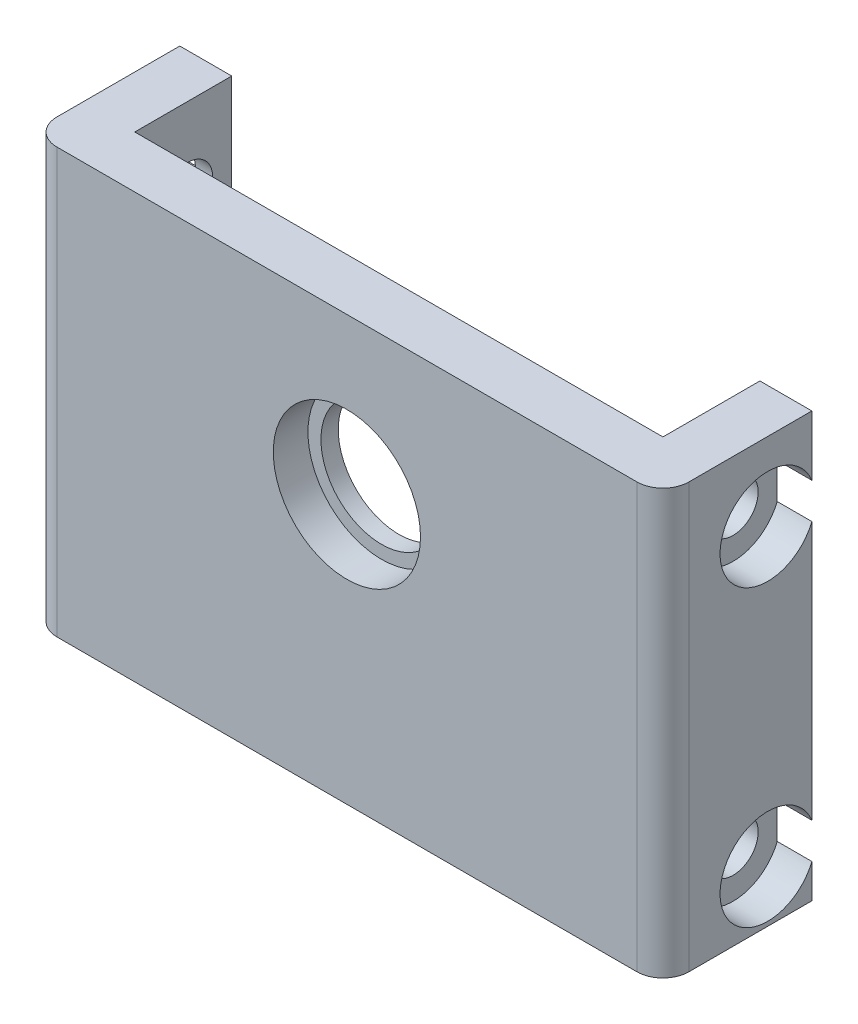
ISO-10303-21;
HEADER;
FILE_DESCRIPTION(('STEP AP214'),'2;1');
FILE_NAME('part.step','',(''),(''),'','','');
FILE_SCHEMA(('AUTOMOTIVE_DESIGN { 1 0 10303 214 1 1 1 1 }'));
ENDSEC;
DATA;
#1=APPLICATION_CONTEXT('core data for automotive mechanical design processes');
#2=APPLICATION_PROTOCOL_DEFINITION('international standard','automotive_design',2000,#1);
#3=PRODUCT_CONTEXT('',#1,'mechanical');
#4=PRODUCT('Part','Part','',(#3));
#5=PRODUCT_RELATED_PRODUCT_CATEGORY('part','',(#4));
#6=PRODUCT_DEFINITION_FORMATION('','',#4);
#7=PRODUCT_DEFINITION_CONTEXT('part definition',#1,'design');
#8=PRODUCT_DEFINITION('design','',#6,#7);
#9=PRODUCT_DEFINITION_SHAPE('','',#8);
#10=(LENGTH_UNIT() NAMED_UNIT(*) SI_UNIT(.MILLI.,.METRE.));
#11=(NAMED_UNIT(*) PLANE_ANGLE_UNIT() SI_UNIT($,.RADIAN.));
#12=(NAMED_UNIT(*) SI_UNIT($,.STERADIAN.) SOLID_ANGLE_UNIT());
#13=UNCERTAINTY_MEASURE_WITH_UNIT(LENGTH_MEASURE(1.E-05),#10,'distance_accuracy_value','');
#14=(GEOMETRIC_REPRESENTATION_CONTEXT(3) GLOBAL_UNCERTAINTY_ASSIGNED_CONTEXT((#13)) GLOBAL_UNIT_ASSIGNED_CONTEXT((#10,
#11,#12)) REPRESENTATION_CONTEXT('',''));
#15=CARTESIAN_POINT('',(0.,0.,0.));
#16=DIRECTION('',(0.,0.,1.));
#17=DIRECTION('',(1.,0.,0.));
#18=AXIS2_PLACEMENT_3D('',#15,#16,#17);
#19=CARTESIAN_POINT('',(33.25,0.,0.));
#20=DIRECTION('',(-1.,0.,0.));
#21=DIRECTION('',(0.,1.,0.));
#22=AXIS2_PLACEMENT_3D('',#19,#20,#21);
#23=PLANE('',#22);
#24=DIRECTION('',(0.,0.,-1.));
#25=VECTOR('',#24,1.);
#26=CARTESIAN_POINT('',(33.25,3.00000000000002,3.25));
#27=LINE('',#26,#25);
#28=CARTESIAN_POINT('',(33.25,3.00000000000002,1.75));
#29=VERTEX_POINT('',#28);
#30=CARTESIAN_POINT('',(33.25,3.00000000000002,-5.34999999999999));
#31=VERTEX_POINT('',#30);
#32=EDGE_CURVE('E241',#29,#31,#27,.T.);
#33=ORIENTED_EDGE('',*,*,#32,.F.);
#34=DIRECTION('',(0.,1.,0.));
#35=VECTOR('',#34,1.);
#36=CARTESIAN_POINT('',(33.25,-21.4999999999988,1.75));
#37=LINE('',#36,#35);
#38=CARTESIAN_POINT('',(33.25,-21.4999999999988,1.75));
#39=VERTEX_POINT('',#38);
#40=EDGE_CURVE('E67',#29,#39,#37,.F.);
#41=ORIENTED_EDGE('',*,*,#40,.T.);
#42=DIRECTION('',(0.,0.,1.));
#43=VECTOR('',#42,1.);
#44=CARTESIAN_POINT('',(33.25,-21.4999999999988,3.25));
#45=LINE('',#44,#43);
#46=CARTESIAN_POINT('',(33.25,-21.4999999999988,-5.34999999999999));
#47=VERTEX_POINT('',#46);
#48=EDGE_CURVE('E225',#47,#39,#45,.T.);
#49=ORIENTED_EDGE('',*,*,#48,.F.);
#50=DIRECTION('',(0.,-1.,0.));
#51=VECTOR('',#50,1.);
#52=CARTESIAN_POINT('',(33.25,3.00000000000002,-5.34999999999999));
#53=LINE('',#52,#51);
#54=CARTESIAN_POINT('',(33.25,-19.5295630140987,-5.34999999999999));
#55=VERTEX_POINT('',#54);
#56=EDGE_CURVE('E251',#55,#47,#53,.T.);
#57=ORIENTED_EDGE('',*,*,#56,.F.);
#58=CARTESIAN_POINT('',(33.25,-18.5,-2.79999999999999));
#59=DIRECTION('',(1.,0.,0.));
#60=DIRECTION('',(0.,0.,-1.));
#61=AXIS2_PLACEMENT_3D('',#58,#59,#60);
#62=CIRCLE('',#61,2.75);
#63=CARTESIAN_POINT('',(33.25,-17.4704369859013,-5.34999999999999));
#64=VERTEX_POINT('',#63);
#65=EDGE_CURVE('E362',#64,#55,#62,.T.);
#66=ORIENTED_EDGE('',*,*,#65,.F.);
#67=CARTESIAN_POINT('',(33.25,-2.52956301409871,-5.34999999999999));
#68=VERTEX_POINT('',#67);
#69=EDGE_CURVE('E249',#68,#64,#53,.T.);
#70=ORIENTED_EDGE('',*,*,#69,.F.);
#71=CARTESIAN_POINT('',(33.25,-1.50000000000002,-2.79999999999999));
#72=DIRECTION('',(1.,0.,0.));
#73=DIRECTION('',(0.,0.,-1.));
#74=AXIS2_PLACEMENT_3D('',#71,#72,#73);
#75=CIRCLE('',#74,2.75);
#76=CARTESIAN_POINT('',(33.25,-0.470436985901328,-5.34999999999999));
#77=VERTEX_POINT('',#76);
#78=EDGE_CURVE('E191',#77,#68,#75,.T.);
#79=ORIENTED_EDGE('',*,*,#78,.F.);
#80=EDGE_CURVE('E197',#31,#77,#53,.T.);
#81=ORIENTED_EDGE('',*,*,#80,.F.);
#82=EDGE_LOOP('',(#33,#41,#49,#57,#66,#70,#79,#81));
#83=FACE_BOUND('',#82,.T.);
#84=ADVANCED_FACE('F43',(#83),#23,.F.);
#85=CARTESIAN_POINT('',(-3.25,0.,0.));
#86=DIRECTION('',(1.,0.,0.));
#87=DIRECTION('',(0.,1.,0.));
#88=AXIS2_PLACEMENT_3D('',#85,#86,#87);
#89=PLANE('',#88);
#90=DIRECTION('',(0.,0.,1.));
#91=VECTOR('',#90,1.);
#92=CARTESIAN_POINT('',(-3.25,-21.4999999999988,3.25));
#93=LINE('',#92,#91);
#94=CARTESIAN_POINT('',(-3.25,-21.4999999999988,-5.34999999999999));
#95=VERTEX_POINT('',#94);
#96=CARTESIAN_POINT('',(-3.25,-21.4999999999988,1.75));
#97=VERTEX_POINT('',#96);
#98=EDGE_CURVE('E278',#95,#97,#93,.T.);
#99=ORIENTED_EDGE('',*,*,#98,.T.);
#100=DIRECTION('',(0.,1.,0.));
#101=VECTOR('',#100,1.);
#102=CARTESIAN_POINT('',(-3.25,3.00000000000002,1.75));
#103=LINE('',#102,#101);
#104=CARTESIAN_POINT('',(-3.25,3.00000000000002,1.75));
#105=VERTEX_POINT('',#104);
#106=EDGE_CURVE('E12',#97,#105,#103,.T.);
#107=ORIENTED_EDGE('',*,*,#106,.T.);
#108=DIRECTION('',(0.,0.,-1.));
#109=VECTOR('',#108,1.);
#110=CARTESIAN_POINT('',(-3.25,3.00000000000002,3.25));
#111=LINE('',#110,#109);
#112=CARTESIAN_POINT('',(-3.25,3.00000000000002,-5.34999999999999));
#113=VERTEX_POINT('',#112);
#114=EDGE_CURVE('E269',#105,#113,#111,.T.);
#115=ORIENTED_EDGE('',*,*,#114,.T.);
#116=DIRECTION('',(0.,-1.,0.));
#117=VECTOR('',#116,1.);
#118=CARTESIAN_POINT('',(-3.25,3.00000000000002,-5.34999999999999));
#119=LINE('',#118,#117);
#120=CARTESIAN_POINT('',(-3.25,-0.470436985901327,-5.34999999999999));
#121=VERTEX_POINT('',#120);
#122=EDGE_CURVE('E274',#113,#121,#119,.T.);
#123=ORIENTED_EDGE('',*,*,#122,.T.);
#124=CARTESIAN_POINT('',(-3.25,-1.50000000000001,-2.79999999999999));
#125=DIRECTION('',(-1.,0.,0.));
#126=DIRECTION('',(0.,0.,1.));
#127=AXIS2_PLACEMENT_3D('',#124,#125,#126);
#128=CIRCLE('',#127,2.75);
#129=CARTESIAN_POINT('',(-3.25,-2.52956301409871,-5.34999999999999));
#130=VERTEX_POINT('',#129);
#131=EDGE_CURVE('E366',#130,#121,#128,.T.);
#132=ORIENTED_EDGE('',*,*,#131,.F.);
#133=CARTESIAN_POINT('',(-3.25,-17.4704369859013,-5.34999999999999));
#134=VERTEX_POINT('',#133);
#135=EDGE_CURVE('E279',#130,#134,#119,.T.);
#136=ORIENTED_EDGE('',*,*,#135,.T.);
#137=CARTESIAN_POINT('',(-3.25,-18.5,-2.79999999999999));
#138=DIRECTION('',(-1.,0.,0.));
#139=DIRECTION('',(0.,0.,1.));
#140=AXIS2_PLACEMENT_3D('',#137,#138,#139);
#141=CIRCLE('',#140,2.75);
#142=CARTESIAN_POINT('',(-3.25,-19.5295630140987,-5.34999999999999));
#143=VERTEX_POINT('',#142);
#144=EDGE_CURVE('E301',#143,#134,#141,.T.);
#145=ORIENTED_EDGE('',*,*,#144,.F.);
#146=EDGE_CURVE('E272',#143,#95,#119,.T.);
#147=ORIENTED_EDGE('',*,*,#146,.T.);
#148=EDGE_LOOP('',(#99,#107,#115,#123,#132,#136,#145,#147));
#149=FACE_BOUND('',#148,.T.);
#150=ADVANCED_FACE('F435',(#149),#89,.F.);
#151=CARTESIAN_POINT('',(-0.249999999999998,-21.4999999999988,3.25));
#152=DIRECTION('',(0.,1.,0.));
#153=DIRECTION('',(0.,0.,1.));
#154=AXIS2_PLACEMENT_3D('',#151,#152,#153);
#155=PLANE('',#154);
#156=ORIENTED_EDGE('',*,*,#48,.T.);
#157=CARTESIAN_POINT('',(31.75,-21.4999999999988,1.75));
#158=DIRECTION('',(0.,1.,0.));
#159=DIRECTION('',(0.,0.,1.));
#160=AXIS2_PLACEMENT_3D('',#157,#158,#159);
#161=CIRCLE('',#160,1.5);
#162=CARTESIAN_POINT('',(31.75,-21.4999999999988,3.25));
#163=VERTEX_POINT('',#162);
#164=EDGE_CURVE('E52',#39,#163,#161,.F.);
#165=ORIENTED_EDGE('',*,*,#164,.T.);
#166=DIRECTION('',(1.,0.,0.));
#167=VECTOR('',#166,1.);
#168=CARTESIAN_POINT('',(-0.249999999999998,-21.4999999999988,3.25));
#169=LINE('',#168,#167);
#170=CARTESIAN_POINT('',(-1.75,-21.4999999999988,3.25));
#171=VERTEX_POINT('',#170);
#172=EDGE_CURVE('E223',#171,#163,#169,.T.);
#173=ORIENTED_EDGE('',*,*,#172,.F.);
#174=CARTESIAN_POINT('',(-1.75,-21.4999999999988,1.75));
#175=DIRECTION('',(0.,1.,0.));
#176=DIRECTION('',(0.,0.,1.));
#177=AXIS2_PLACEMENT_3D('',#174,#175,#176);
#178=CIRCLE('',#177,1.5);
#179=EDGE_CURVE('E59',#171,#97,#178,.F.);
#180=ORIENTED_EDGE('',*,*,#179,.T.);
#181=ORIENTED_EDGE('',*,*,#98,.F.);
#182=DIRECTION('',(1.,0.,0.));
#183=VECTOR('',#182,1.);
#184=CARTESIAN_POINT('',(-3.25,-21.4999999999988,-5.34999999999999));
#185=LINE('',#184,#183);
#186=CARTESIAN_POINT('',(-0.249999999999998,-21.4999999999988,-5.34999999999999));
#187=VERTEX_POINT('',#186);
#188=EDGE_CURVE('E282',#95,#187,#185,.T.);
#189=ORIENTED_EDGE('',*,*,#188,.T.);
#190=DIRECTION('',(0.,0.,1.));
#191=VECTOR('',#190,1.);
#192=CARTESIAN_POINT('',(-0.249999999999998,-21.4999999999988,3.25));
#193=LINE('',#192,#191);
#194=CARTESIAN_POINT('',(-0.249999999999998,-21.4999999999988,0.25));
#195=VERTEX_POINT('',#194);
#196=EDGE_CURVE('E273',#187,#195,#193,.T.);
#197=ORIENTED_EDGE('',*,*,#196,.T.);
#198=DIRECTION('',(1.,0.,0.));
#199=VECTOR('',#198,1.);
#200=CARTESIAN_POINT('',(-0.249999999999998,-21.4999999999988,0.25));
#201=LINE('',#200,#199);
#202=CARTESIAN_POINT('',(30.25,-21.4999999999988,0.25));
#203=VERTEX_POINT('',#202);
#204=EDGE_CURVE('E305',#195,#203,#201,.T.);
#205=ORIENTED_EDGE('',*,*,#204,.T.);
#206=DIRECTION('',(0.,0.,1.));
#207=VECTOR('',#206,1.);
#208=CARTESIAN_POINT('',(30.25,-21.4999999999988,3.25));
#209=LINE('',#208,#207);
#210=CARTESIAN_POINT('',(30.25,-21.4999999999988,-5.34999999999999));
#211=VERTEX_POINT('',#210);
#212=EDGE_CURVE('E254',#211,#203,#209,.T.);
#213=ORIENTED_EDGE('',*,*,#212,.F.);
#214=DIRECTION('',(-1.,0.,0.));
#215=VECTOR('',#214,1.);
#216=CARTESIAN_POINT('',(33.25,-21.4999999999988,-5.34999999999999));
#217=LINE('',#216,#215);
#218=EDGE_CURVE('E247',#47,#211,#217,.T.);
#219=ORIENTED_EDGE('',*,*,#218,.F.);
#220=EDGE_LOOP('',(#156,#165,#173,#180,#181,#189,#197,#205,#213,#219));
#221=FACE_BOUND('',#220,.T.);
#222=ADVANCED_FACE('F222',(#221),#155,.F.);
#223=CARTESIAN_POINT('',(-0.250000000000001,3.00000000000002,3.25));
#224=DIRECTION('',(0.,-1.,0.));
#225=DIRECTION('',(0.,0.,-1.));
#226=AXIS2_PLACEMENT_3D('',#223,#224,#225);
#227=PLANE('',#226);
#228=DIRECTION('',(-1.,0.,0.));
#229=VECTOR('',#228,1.);
#230=CARTESIAN_POINT('',(-0.250000000000001,3.00000000000002,3.25));
#231=LINE('',#230,#229);
#232=CARTESIAN_POINT('',(31.75,3.00000000000002,3.25));
#233=VERTEX_POINT('',#232);
#234=CARTESIAN_POINT('',(-1.75,3.00000000000002,3.25));
#235=VERTEX_POINT('',#234);
#236=EDGE_CURVE('E234',#233,#235,#231,.T.);
#237=ORIENTED_EDGE('',*,*,#236,.F.);
#238=CARTESIAN_POINT('',(31.75,3.00000000000002,1.75));
#239=DIRECTION('',(0.,-1.,0.));
#240=DIRECTION('',(0.,0.,-1.));
#241=AXIS2_PLACEMENT_3D('',#238,#239,#240);
#242=CIRCLE('',#241,1.5);
#243=EDGE_CURVE('E213',#233,#29,#242,.F.);
#244=ORIENTED_EDGE('',*,*,#243,.T.);
#245=ORIENTED_EDGE('',*,*,#32,.T.);
#246=DIRECTION('',(-1.,0.,0.));
#247=VECTOR('',#246,1.);
#248=CARTESIAN_POINT('',(33.25,3.00000000000002,-5.34999999999999));
#249=LINE('',#248,#247);
#250=CARTESIAN_POINT('',(30.25,3.00000000000002,-5.34999999999999));
#251=VERTEX_POINT('',#250);
#252=EDGE_CURVE('E243',#31,#251,#249,.T.);
#253=ORIENTED_EDGE('',*,*,#252,.T.);
#254=DIRECTION('',(0.,0.,-1.));
#255=VECTOR('',#254,1.);
#256=CARTESIAN_POINT('',(30.25,3.00000000000002,3.25));
#257=LINE('',#256,#255);
#258=CARTESIAN_POINT('',(30.25,3.00000000000002,0.25));
#259=VERTEX_POINT('',#258);
#260=EDGE_CURVE('E263',#259,#251,#257,.T.);
#261=ORIENTED_EDGE('',*,*,#260,.F.);
#262=DIRECTION('',(-1.,0.,0.));
#263=VECTOR('',#262,1.);
#264=CARTESIAN_POINT('',(-0.250000000000001,3.00000000000002,0.25));
#265=LINE('',#264,#263);
#266=CARTESIAN_POINT('',(-0.250000000000001,3.00000000000002,0.25));
#267=VERTEX_POINT('',#266);
#268=EDGE_CURVE('E235',#259,#267,#265,.T.);
#269=ORIENTED_EDGE('',*,*,#268,.T.);
#270=DIRECTION('',(0.,0.,-1.));
#271=VECTOR('',#270,1.);
#272=CARTESIAN_POINT('',(-0.250000000000001,3.00000000000002,3.25));
#273=LINE('',#272,#271);
#274=CARTESIAN_POINT('',(-0.250000000000001,3.00000000000002,-5.34999999999999));
#275=VERTEX_POINT('',#274);
#276=EDGE_CURVE('E268',#267,#275,#273,.T.);
#277=ORIENTED_EDGE('',*,*,#276,.T.);
#278=DIRECTION('',(1.,0.,0.));
#279=VECTOR('',#278,1.);
#280=CARTESIAN_POINT('',(-3.25,3.00000000000002,-5.34999999999999));
#281=LINE('',#280,#279);
#282=EDGE_CURVE('E294',#113,#275,#281,.T.);
#283=ORIENTED_EDGE('',*,*,#282,.F.);
#284=ORIENTED_EDGE('',*,*,#114,.F.);
#285=CARTESIAN_POINT('',(-1.75,3.00000000000002,1.75));
#286=DIRECTION('',(0.,-1.,0.));
#287=DIRECTION('',(0.,0.,-1.));
#288=AXIS2_PLACEMENT_3D('',#285,#286,#287);
#289=CIRCLE('',#288,1.5);
#290=EDGE_CURVE('E210',#105,#235,#289,.F.);
#291=ORIENTED_EDGE('',*,*,#290,.T.);
#292=EDGE_LOOP('',(#237,#244,#245,#253,#261,#269,#277,#283,#284,#291));
#293=FACE_BOUND('',#292,.T.);
#294=ADVANCED_FACE('F239',(#293),#227,.F.);
#295=CARTESIAN_POINT('',(0.,0.,3.25));
#296=DIRECTION('',(0.,0.,1.));
#297=DIRECTION('',(1.,0.,0.));
#298=AXIS2_PLACEMENT_3D('',#295,#296,#297);
#299=PLANE('',#298);
#300=CARTESIAN_POINT('',(15.,-6.00000000000003,3.25));
#301=DIRECTION('',(0.,0.,1.));
#302=DIRECTION('',(1.,0.,0.));
#303=AXIS2_PLACEMENT_3D('',#300,#301,#302);
#304=CIRCLE('',#303,4.25000000000001);
#305=CARTESIAN_POINT('',(19.25,-6.00000000000003,3.25));
#306=VERTEX_POINT('',#305);
#307=EDGE_CURVE('E318',#306,#306,#304,.T.);
#308=ORIENTED_EDGE('',*,*,#307,.F.);
#309=EDGE_LOOP('',(#308));
#310=FACE_BOUND('',#309,.T.);
#311=ORIENTED_EDGE('',*,*,#172,.T.);
#312=DIRECTION('',(0.,1.,0.));
#313=VECTOR('',#312,1.);
#314=CARTESIAN_POINT('',(31.75,3.00000000000002,3.25));
#315=LINE('',#314,#313);
#316=EDGE_CURVE('E203',#163,#233,#315,.T.);
#317=ORIENTED_EDGE('',*,*,#316,.T.);
#318=ORIENTED_EDGE('',*,*,#236,.T.);
#319=DIRECTION('',(0.,1.,0.));
#320=VECTOR('',#319,1.);
#321=CARTESIAN_POINT('',(-1.75,-21.4999999999988,3.25));
#322=LINE('',#321,#320);
#323=EDGE_CURVE('E199',#235,#171,#322,.F.);
#324=ORIENTED_EDGE('',*,*,#323,.T.);
#325=EDGE_LOOP('',(#311,#317,#318,#324));
#326=FACE_BOUND('',#325,.T.);
#327=ADVANCED_FACE('F229',(#310,#326),#299,.T.);
#328=CARTESIAN_POINT('',(0.,0.,0.25));
#329=DIRECTION('',(0.,0.,1.));
#330=DIRECTION('',(1.,0.,0.));
#331=AXIS2_PLACEMENT_3D('',#328,#329,#330);
#332=PLANE('',#331);
#333=CARTESIAN_POINT('',(15.,-6.00000000000001,0.25));
#334=DIRECTION('',(0.,0.,1.));
#335=DIRECTION('',(1.,0.,0.));
#336=AXIS2_PLACEMENT_3D('',#333,#334,#335);
#337=CIRCLE('',#336,3.5);
#338=CARTESIAN_POINT('',(18.5,-6.00000000000001,0.25));
#339=VERTEX_POINT('',#338);
#340=EDGE_CURVE('E314',#339,#339,#337,.T.);
#341=ORIENTED_EDGE('',*,*,#340,.T.);
#342=EDGE_LOOP('',(#341));
#343=FACE_BOUND('',#342,.T.);
#344=DIRECTION('',(0.,-1.,0.));
#345=VECTOR('',#344,1.);
#346=CARTESIAN_POINT('',(-0.250000000000001,3.00000000000002,0.25));
#347=LINE('',#346,#345);
#348=EDGE_CURVE('E297',#267,#195,#347,.T.);
#349=ORIENTED_EDGE('',*,*,#348,.F.);
#350=ORIENTED_EDGE('',*,*,#268,.F.);
#351=DIRECTION('',(0.,1.,0.));
#352=VECTOR('',#351,1.);
#353=CARTESIAN_POINT('',(30.25,3.00000000000002,0.25));
#354=LINE('',#353,#352);
#355=EDGE_CURVE('E308',#203,#259,#354,.T.);
#356=ORIENTED_EDGE('',*,*,#355,.F.);
#357=ORIENTED_EDGE('',*,*,#204,.F.);
#358=EDGE_LOOP('',(#349,#350,#356,#357));
#359=FACE_BOUND('',#358,.T.);
#360=ADVANCED_FACE('F423',(#343,#359),#332,.F.);
#361=CARTESIAN_POINT('',(-3.25,3.00000000000002,-5.34999999999999));
#362=DIRECTION('',(0.,0.,1.));
#363=DIRECTION('',(0.,-1.,0.));
#364=AXIS2_PLACEMENT_3D('',#361,#362,#363);
#365=PLANE('',#364);
#366=DIRECTION('',(0.,1.,0.));
#367=VECTOR('',#366,1.);
#368=CARTESIAN_POINT('',(-1.25,3.00000000000002,-5.34999999999999));
#369=LINE('',#368,#367);
#370=CARTESIAN_POINT('',(-1.25,-2.52956301409871,-5.34999999999999));
#371=VERTEX_POINT('',#370);
#372=CARTESIAN_POINT('',(-1.25,-0.470436985901319,-5.34999999999999));
#373=VERTEX_POINT('',#372);
#374=EDGE_CURVE('E332',#371,#373,#369,.T.);
#375=ORIENTED_EDGE('',*,*,#374,.T.);
#376=DIRECTION('',(-1.,0.,0.));
#377=VECTOR('',#376,1.);
#378=CARTESIAN_POINT('',(-3.25,-0.470436985901323,-5.34999999999999));
#379=LINE('',#378,#377);
#380=EDGE_CURVE('E340',#373,#121,#379,.T.);
#381=ORIENTED_EDGE('',*,*,#380,.T.);
#382=ORIENTED_EDGE('',*,*,#122,.F.);
#383=ORIENTED_EDGE('',*,*,#282,.T.);
#384=DIRECTION('',(0.,-1.,0.));
#385=VECTOR('',#384,1.);
#386=CARTESIAN_POINT('',(-0.250000000000001,3.00000000000002,-5.34999999999999));
#387=LINE('',#386,#385);
#388=EDGE_CURVE('E285',#275,#187,#387,.T.);
#389=ORIENTED_EDGE('',*,*,#388,.T.);
#390=ORIENTED_EDGE('',*,*,#188,.F.);
#391=ORIENTED_EDGE('',*,*,#146,.F.);
#392=DIRECTION('',(-1.,0.,0.));
#393=VECTOR('',#392,1.);
#394=CARTESIAN_POINT('',(-3.25,-19.5295630140987,-5.34999999999999));
#395=LINE('',#394,#393);
#396=CARTESIAN_POINT('',(-1.25,-19.5295630140987,-5.34999999999999));
#397=VERTEX_POINT('',#396);
#398=EDGE_CURVE('E320',#143,#397,#395,.F.);
#399=ORIENTED_EDGE('',*,*,#398,.T.);
#400=DIRECTION('',(0.,1.,0.));
#401=VECTOR('',#400,1.);
#402=CARTESIAN_POINT('',(-1.25,3.00000000000002,-5.34999999999999));
#403=LINE('',#402,#401);
#404=CARTESIAN_POINT('',(-1.25,-17.4704369859013,-5.34999999999999));
#405=VERTEX_POINT('',#404);
#406=EDGE_CURVE('E324',#397,#405,#403,.T.);
#407=ORIENTED_EDGE('',*,*,#406,.T.);
#408=DIRECTION('',(-1.,0.,0.));
#409=VECTOR('',#408,1.);
#410=CARTESIAN_POINT('',(-3.25,-17.4704369859013,-5.34999999999999));
#411=LINE('',#410,#409);
#412=EDGE_CURVE('E328',#405,#134,#411,.T.);
#413=ORIENTED_EDGE('',*,*,#412,.T.);
#414=ORIENTED_EDGE('',*,*,#135,.F.);
#415=DIRECTION('',(-1.,0.,0.));
#416=VECTOR('',#415,1.);
#417=CARTESIAN_POINT('',(-3.25,-2.52956301409871,-5.34999999999999));
#418=LINE('',#417,#416);
#419=EDGE_CURVE('E336',#130,#371,#418,.F.);
#420=ORIENTED_EDGE('',*,*,#419,.T.);
#421=EDGE_LOOP('',(#375,#381,#382,#383,#389,#390,#391,#399,#407,#413,#414,#420));
#422=FACE_BOUND('',#421,.T.);
#423=ADVANCED_FACE('F430',(#422),#365,.F.);
#424=CARTESIAN_POINT('',(-0.25,0.,0.));
#425=DIRECTION('',(1.,0.,0.));
#426=DIRECTION('',(0.,1.,0.));
#427=AXIS2_PLACEMENT_3D('',#424,#425,#426);
#428=PLANE('',#427);
#429=CARTESIAN_POINT('',(-0.25,-1.50000000000001,-2.79999999999999));
#430=DIRECTION('',(1.,0.,0.));
#431=DIRECTION('',(0.,1.,0.));
#432=AXIS2_PLACEMENT_3D('',#429,#430,#431);
#433=CIRCLE('',#432,1.45);
#434=CARTESIAN_POINT('',(-0.25,-0.0500000000000149,-2.79999999999999));
#435=VERTEX_POINT('',#434);
#436=EDGE_CURVE('E382',#435,#435,#433,.T.);
#437=ORIENTED_EDGE('',*,*,#436,.F.);
#438=EDGE_LOOP('',(#437));
#439=FACE_BOUND('',#438,.T.);
#440=CARTESIAN_POINT('',(-0.249999999999998,-18.5,-2.79999999999999));
#441=DIRECTION('',(1.,0.,0.));
#442=DIRECTION('',(0.,1.,0.));
#443=AXIS2_PLACEMENT_3D('',#440,#441,#442);
#444=CIRCLE('',#443,1.45);
#445=CARTESIAN_POINT('',(-0.249999999999998,-17.05,-2.79999999999999));
#446=VERTEX_POINT('',#445);
#447=EDGE_CURVE('E397',#446,#446,#444,.T.);
#448=ORIENTED_EDGE('',*,*,#447,.F.);
#449=EDGE_LOOP('',(#448));
#450=FACE_BOUND('',#449,.T.);
#451=ORIENTED_EDGE('',*,*,#276,.F.);
#452=ORIENTED_EDGE('',*,*,#348,.T.);
#453=ORIENTED_EDGE('',*,*,#196,.F.);
#454=ORIENTED_EDGE('',*,*,#388,.F.);
#455=EDGE_LOOP('',(#451,#452,#453,#454));
#456=FACE_BOUND('',#455,.T.);
#457=ADVANCED_FACE('F427',(#439,#450,#456),#428,.T.);
#458=CARTESIAN_POINT('',(33.25,3.00000000000002,-5.34999999999999));
#459=DIRECTION('',(0.,0.,-1.));
#460=DIRECTION('',(0.,1.,0.));
#461=AXIS2_PLACEMENT_3D('',#458,#459,#460);
#462=PLANE('',#461);
#463=DIRECTION('',(1.,0.,0.));
#464=VECTOR('',#463,1.);
#465=CARTESIAN_POINT('',(33.25,-0.470436985901324,-5.34999999999999));
#466=LINE('',#465,#464);
#467=CARTESIAN_POINT('',(31.25,-0.470436985901319,-5.34999999999999));
#468=VERTEX_POINT('',#467);
#469=EDGE_CURVE('E187',#468,#77,#466,.T.);
#470=ORIENTED_EDGE('',*,*,#469,.F.);
#471=DIRECTION('',(0.,1.,0.));
#472=VECTOR('',#471,1.);
#473=CARTESIAN_POINT('',(31.25,3.00000000000002,-5.34999999999999));
#474=LINE('',#473,#472);
#475=CARTESIAN_POINT('',(31.25,-2.52956301409871,-5.34999999999999));
#476=VERTEX_POINT('',#475);
#477=EDGE_CURVE('E172',#476,#468,#474,.T.);
#478=ORIENTED_EDGE('',*,*,#477,.F.);
#479=DIRECTION('',(1.,0.,0.));
#480=VECTOR('',#479,1.);
#481=CARTESIAN_POINT('',(33.25,-2.52956301409871,-5.34999999999999));
#482=LINE('',#481,#480);
#483=EDGE_CURVE('E182',#68,#476,#482,.F.);
#484=ORIENTED_EDGE('',*,*,#483,.F.);
#485=ORIENTED_EDGE('',*,*,#69,.T.);
#486=DIRECTION('',(1.,0.,0.));
#487=VECTOR('',#486,1.);
#488=CARTESIAN_POINT('',(33.25,-17.4704369859013,-5.34999999999999));
#489=LINE('',#488,#487);
#490=CARTESIAN_POINT('',(31.25,-17.4704369859013,-5.34999999999999));
#491=VERTEX_POINT('',#490);
#492=EDGE_CURVE('E357',#491,#64,#489,.T.);
#493=ORIENTED_EDGE('',*,*,#492,.F.);
#494=DIRECTION('',(0.,1.,0.));
#495=VECTOR('',#494,1.);
#496=CARTESIAN_POINT('',(31.25,3.00000000000002,-5.34999999999999));
#497=LINE('',#496,#495);
#498=CARTESIAN_POINT('',(31.25,-19.5295630140987,-5.34999999999999));
#499=VERTEX_POINT('',#498);
#500=EDGE_CURVE('E183',#499,#491,#497,.T.);
#501=ORIENTED_EDGE('',*,*,#500,.F.);
#502=DIRECTION('',(1.,0.,0.));
#503=VECTOR('',#502,1.);
#504=CARTESIAN_POINT('',(33.25,-19.5295630140987,-5.34999999999999));
#505=LINE('',#504,#503);
#506=EDGE_CURVE('E359',#55,#499,#505,.F.);
#507=ORIENTED_EDGE('',*,*,#506,.F.);
#508=ORIENTED_EDGE('',*,*,#56,.T.);
#509=ORIENTED_EDGE('',*,*,#218,.T.);
#510=DIRECTION('',(0.,-1.,0.));
#511=VECTOR('',#510,1.);
#512=CARTESIAN_POINT('',(30.25,3.00000000000002,-5.34999999999999));
#513=LINE('',#512,#511);
#514=EDGE_CURVE('E258',#251,#211,#513,.T.);
#515=ORIENTED_EDGE('',*,*,#514,.F.);
#516=ORIENTED_EDGE('',*,*,#252,.F.);
#517=ORIENTED_EDGE('',*,*,#80,.T.);
#518=EDGE_LOOP('',(#470,#478,#484,#485,#493,#501,#507,#508,#509,#515,#516,#517));
#519=FACE_BOUND('',#518,.T.);
#520=ADVANCED_FACE('F194',(#519),#462,.T.);
#521=CARTESIAN_POINT('',(30.25,0.,0.));
#522=DIRECTION('',(-1.,0.,0.));
#523=DIRECTION('',(0.,1.,0.));
#524=AXIS2_PLACEMENT_3D('',#521,#522,#523);
#525=PLANE('',#524);
#526=CARTESIAN_POINT('',(30.25,-1.50000000000002,-2.79999999999999));
#527=DIRECTION('',(-1.,0.,0.));
#528=DIRECTION('',(0.,-1.,0.));
#529=AXIS2_PLACEMENT_3D('',#526,#527,#528);
#530=CIRCLE('',#529,1.45);
#531=CARTESIAN_POINT('',(30.25,-2.95000000000002,-2.79999999999999));
#532=VERTEX_POINT('',#531);
#533=EDGE_CURVE('E732',#532,#532,#530,.T.);
#534=ORIENTED_EDGE('',*,*,#533,.F.);
#535=EDGE_LOOP('',(#534));
#536=FACE_BOUND('',#535,.T.);
#537=CARTESIAN_POINT('',(30.25,-18.5,-2.79999999999999));
#538=DIRECTION('',(-1.,0.,0.));
#539=DIRECTION('',(0.,-1.,0.));
#540=AXIS2_PLACEMENT_3D('',#537,#538,#539);
#541=CIRCLE('',#540,1.45);
#542=CARTESIAN_POINT('',(30.25,-19.95,-2.79999999999999));
#543=VERTEX_POINT('',#542);
#544=EDGE_CURVE('E372',#543,#543,#541,.T.);
#545=ORIENTED_EDGE('',*,*,#544,.F.);
#546=EDGE_LOOP('',(#545));
#547=FACE_BOUND('',#546,.T.);
#548=ORIENTED_EDGE('',*,*,#212,.T.);
#549=ORIENTED_EDGE('',*,*,#355,.T.);
#550=ORIENTED_EDGE('',*,*,#260,.T.);
#551=ORIENTED_EDGE('',*,*,#514,.T.);
#552=EDGE_LOOP('',(#548,#549,#550,#551));
#553=FACE_BOUND('',#552,.T.);
#554=ADVANCED_FACE('F417',(#536,#547,#553),#525,.T.);
#555=CARTESIAN_POINT('',(15.,-6.00000000000003,-11.7708152801713));
#556=DIRECTION('',(0.,0.,1.));
#557=DIRECTION('',(1.,0.,0.));
#558=AXIS2_PLACEMENT_3D('',#555,#556,#557);
#559=CYLINDRICAL_SURFACE('',#558,4.25000000000001);
#560=CARTESIAN_POINT('',(15.,-6.00000000000003,1.25));
#561=DIRECTION('',(0.,0.,1.));
#562=DIRECTION('',(1.,0.,0.));
#563=AXIS2_PLACEMENT_3D('',#560,#561,#562);
#564=CIRCLE('',#563,4.25000000000001);
#565=CARTESIAN_POINT('',(19.25,-6.00000000000003,1.25));
#566=VERTEX_POINT('',#565);
#567=EDGE_CURVE('E259',#566,#566,#564,.F.);
#568=CARTESIAN_POINT('',(19.25,-6.00000000000003,1.25));
#569=CARTESIAN_POINT('',(19.25,-6.00000000000003,1.27083333333333));
#570=CARTESIAN_POINT('',(19.25,-6.00000000000003,1.29166666666667));
#571=CARTESIAN_POINT('',(19.25,-6.00000000000003,1.33333333333333));
#572=CARTESIAN_POINT('',(19.25,-6.00000000000003,1.35416666666667));
#573=CARTESIAN_POINT('',(19.25,-6.00000000000003,1.39583333333333));
#574=CARTESIAN_POINT('',(19.25,-6.00000000000003,1.41666666666667));
#575=CARTESIAN_POINT('',(19.25,-6.00000000000003,1.45833333333333));
#576=CARTESIAN_POINT('',(19.25,-6.00000000000003,1.47916666666667));
#577=CARTESIAN_POINT('',(19.25,-6.00000000000003,1.52083333333333));
#578=CARTESIAN_POINT('',(19.25,-6.00000000000003,1.54166666666667));
#579=CARTESIAN_POINT('',(19.25,-6.00000000000003,1.58333333333333));
#580=CARTESIAN_POINT('',(19.25,-6.00000000000003,1.60416666666667));
#581=CARTESIAN_POINT('',(19.25,-6.00000000000003,1.64583333333333));
#582=CARTESIAN_POINT('',(19.25,-6.00000000000003,1.66666666666667));
#583=CARTESIAN_POINT('',(19.25,-6.00000000000003,1.70833333333333));
#584=CARTESIAN_POINT('',(19.25,-6.00000000000003,1.72916666666667));
#585=CARTESIAN_POINT('',(19.25,-6.00000000000003,1.77083333333333));
#586=CARTESIAN_POINT('',(19.25,-6.00000000000003,1.79166666666667));
#587=CARTESIAN_POINT('',(19.25,-6.00000000000003,1.83333333333333));
#588=CARTESIAN_POINT('',(19.25,-6.00000000000003,1.85416666666667));
#589=CARTESIAN_POINT('',(19.25,-6.00000000000003,1.89583333333333));
#590=CARTESIAN_POINT('',(19.25,-6.00000000000003,1.91666666666667));
#591=CARTESIAN_POINT('',(19.25,-6.00000000000003,1.95833333333333));
#592=CARTESIAN_POINT('',(19.25,-6.00000000000003,1.97916666666667));
#593=CARTESIAN_POINT('',(19.25,-6.00000000000003,2.02083333333333));
#594=CARTESIAN_POINT('',(19.25,-6.00000000000003,2.04166666666667));
#595=CARTESIAN_POINT('',(19.25,-6.00000000000003,2.08333333333333));
#596=CARTESIAN_POINT('',(19.25,-6.00000000000003,2.10416666666667));
#597=CARTESIAN_POINT('',(19.25,-6.00000000000003,2.14583333333333));
#598=CARTESIAN_POINT('',(19.25,-6.00000000000003,2.16666666666667));
#599=CARTESIAN_POINT('',(19.25,-6.00000000000003,2.20833333333333));
#600=CARTESIAN_POINT('',(19.25,-6.00000000000003,2.22916666666667));
#601=CARTESIAN_POINT('',(19.25,-6.00000000000003,2.27083333333333));
#602=CARTESIAN_POINT('',(19.25,-6.00000000000003,2.29166666666667));
#603=CARTESIAN_POINT('',(19.25,-6.00000000000003,2.33333333333333));
#604=CARTESIAN_POINT('',(19.25,-6.00000000000003,2.35416666666667));
#605=CARTESIAN_POINT('',(19.25,-6.00000000000003,2.39583333333333));
#606=CARTESIAN_POINT('',(19.25,-6.00000000000003,2.41666666666667));
#607=CARTESIAN_POINT('',(19.25,-6.00000000000003,2.45833333333333));
#608=CARTESIAN_POINT('',(19.25,-6.00000000000003,2.47916666666667));
#609=CARTESIAN_POINT('',(19.25,-6.00000000000003,2.52083333333333));
#610=CARTESIAN_POINT('',(19.25,-6.00000000000003,2.54166666666667));
#611=CARTESIAN_POINT('',(19.25,-6.00000000000003,2.58333333333333));
#612=CARTESIAN_POINT('',(19.25,-6.00000000000003,2.60416666666667));
#613=CARTESIAN_POINT('',(19.25,-6.00000000000003,2.64583333333333));
#614=CARTESIAN_POINT('',(19.25,-6.00000000000003,2.66666666666667));
#615=CARTESIAN_POINT('',(19.25,-6.00000000000003,2.70833333333333));
#616=CARTESIAN_POINT('',(19.25,-6.00000000000003,2.72916666666667));
#617=CARTESIAN_POINT('',(19.25,-6.00000000000003,2.77083333333333));
#618=CARTESIAN_POINT('',(19.25,-6.00000000000003,2.79166666666667));
#619=CARTESIAN_POINT('',(19.25,-6.00000000000003,2.83333333333333));
#620=CARTESIAN_POINT('',(19.25,-6.00000000000003,2.85416666666667));
#621=CARTESIAN_POINT('',(19.25,-6.00000000000003,2.89583333333333));
#622=CARTESIAN_POINT('',(19.25,-6.00000000000003,2.91666666666667));
#623=CARTESIAN_POINT('',(19.25,-6.00000000000003,2.95833333333333));
#624=CARTESIAN_POINT('',(19.25,-6.00000000000003,2.97916666666667));
#625=CARTESIAN_POINT('',(19.25,-6.00000000000003,3.02083333333333));
#626=CARTESIAN_POINT('',(19.25,-6.00000000000003,3.04166666666667));
#627=CARTESIAN_POINT('',(19.25,-6.00000000000003,3.08333333333333));
#628=CARTESIAN_POINT('',(19.25,-6.00000000000003,3.10416666666667));
#629=CARTESIAN_POINT('',(19.25,-6.00000000000003,3.14583333333333));
#630=CARTESIAN_POINT('',(19.25,-6.00000000000003,3.16666666666667));
#631=CARTESIAN_POINT('',(19.25,-6.00000000000003,3.20833333333333));
#632=CARTESIAN_POINT('',(19.25,-6.00000000000003,3.22916666666667));
#633=CARTESIAN_POINT('',(19.25,-6.00000000000003,3.25));
#634=B_SPLINE_CURVE_WITH_KNOTS('',3,(#568,#569,#570,#571,#572,#573,#574,#575,#576,#577,#578,
#579,#580,#581,#582,#583,#584,#585,#586,#587,#588,#589,#590,#591,#592,#593,#594,#595,#596,#597,
#598,#599,#600,#601,#602,#603,#604,#605,#606,#607,#608,#609,#610,#611,#612,#613,#614,#615,#616,
#617,#618,#619,#620,#621,#622,#623,#624,#625,#626,#627,#628,#629,#630,#631,#632,#633),
.UNSPECIFIED.,.F.,.F.,(4,2,2,2,2,2,2,2,2,2,2,2,2,2,2,2,2,2,2,2,2,2,2,2,2,2,2,2,2,2,2,2,4),(0.,
0.0625000000000001,0.125,0.1875,0.25,0.3125,0.375,0.4375,0.5,0.5625,0.625000000000001,
0.687500000000001,0.750000000000001,0.812500000000001,0.875000000000001,0.937500000000001,1.,
1.0625,1.125,1.1875,1.25,1.3125,1.375,1.4375,1.5,1.5625,1.625,1.6875,1.75,1.8125,1.875,1.9375,
2.),.UNSPECIFIED.);
#635=EDGE_CURVE('BSEAM476',#566,#306,#634,.T.);
#636=ORIENTED_EDGE('',*,*,#567,.T.);
#637=ORIENTED_EDGE('',*,*,#307,.T.);
#638=ORIENTED_EDGE('',*,*,#635,.T.);
#639=ORIENTED_EDGE('',*,*,#635,.F.);
#640=EDGE_LOOP('',(#636,#638,#637,#639));
#641=FACE_BOUND('',#640,.T.);
#642=ADVANCED_FACE('F476',(#641),#559,.F.);
#643=CARTESIAN_POINT('',(0.,0.,1.25));
#644=DIRECTION('',(0.,0.,1.));
#645=DIRECTION('',(1.,0.,0.));
#646=AXIS2_PLACEMENT_3D('',#643,#644,#645);
#647=PLANE('',#646);
#648=CARTESIAN_POINT('',(15.,-6.00000000000001,1.25));
#649=DIRECTION('',(0.,0.,1.));
#650=DIRECTION('',(1.,0.,0.));
#651=AXIS2_PLACEMENT_3D('',#648,#649,#650);
#652=CIRCLE('',#651,3.5);
#653=CARTESIAN_POINT('',(18.5,-6.00000000000001,1.25));
#654=VERTEX_POINT('',#653);
#655=EDGE_CURVE('E319',#654,#654,#652,.T.);
#656=ORIENTED_EDGE('',*,*,#655,.F.);
#657=EDGE_LOOP('',(#656));
#658=FACE_BOUND('',#657,.T.);
#659=ORIENTED_EDGE('',*,*,#567,.F.);
#660=EDGE_LOOP('',(#659));
#661=FACE_BOUND('',#660,.T.);
#662=ADVANCED_FACE('F462',(#658,#661),#647,.T.);
#663=CARTESIAN_POINT('',(15.,-6.00000000000001,-5.34999999999999));
#664=DIRECTION('',(0.,0.,1.));
#665=DIRECTION('',(1.,0.,0.));
#666=AXIS2_PLACEMENT_3D('',#663,#664,#665);
#667=CYLINDRICAL_SURFACE('',#666,3.5);
#668=ORIENTED_EDGE('',*,*,#655,.T.);
#669=EDGE_LOOP('',(#668));
#670=FACE_BOUND('',#669,.T.);
#671=ORIENTED_EDGE('',*,*,#340,.F.);
#672=EDGE_LOOP('',(#671));
#673=FACE_BOUND('',#672,.T.);
#674=ADVANCED_FACE('F453',(#670,#673),#667,.F.);
#675=CARTESIAN_POINT('',(-1.25,-17.05,-2.79999999999999));
#676=DIRECTION('',(1.,0.,0.));
#677=DIRECTION('',(0.,0.,-1.));
#678=AXIS2_PLACEMENT_3D('',#675,#676,#677);
#679=PLANE('',#678);
#680=CARTESIAN_POINT('',(-1.25,-18.5,-2.79999999999999));
#681=DIRECTION('',(-1.,0.,0.));
#682=DIRECTION('',(0.,0.,1.));
#683=AXIS2_PLACEMENT_3D('',#680,#681,#682);
#684=CIRCLE('',#683,1.45);
#685=CARTESIAN_POINT('',(-1.25,-18.5,-1.34999999999999));
#686=VERTEX_POINT('',#685);
#687=EDGE_CURVE('E393',#686,#686,#684,.T.);
#688=ORIENTED_EDGE('',*,*,#687,.F.);
#689=EDGE_LOOP('',(#688));
#690=FACE_BOUND('',#689,.T.);
#691=CARTESIAN_POINT('',(-1.25,-18.5,-2.79999999999999));
#692=DIRECTION('',(-1.,0.,0.));
#693=DIRECTION('',(0.,0.,1.));
#694=AXIS2_PLACEMENT_3D('',#691,#692,#693);
#695=CIRCLE('',#694,2.75);
#696=EDGE_CURVE('E386',#397,#405,#695,.T.);
#697=ORIENTED_EDGE('',*,*,#696,.T.);
#698=ORIENTED_EDGE('',*,*,#406,.F.);
#699=EDGE_LOOP('',(#697,#698));
#700=FACE_BOUND('',#699,.T.);
#701=ADVANCED_FACE('F451',(#690,#700),#679,.F.);
#702=CARTESIAN_POINT('',(-3.25,-18.5,-2.79999999999999));
#703=DIRECTION('',(-1.,0.,0.));
#704=DIRECTION('',(0.,0.,1.));
#705=AXIS2_PLACEMENT_3D('',#702,#703,#704);
#706=CYLINDRICAL_SURFACE('',#705,2.75);
#707=ORIENTED_EDGE('',*,*,#696,.F.);
#708=ORIENTED_EDGE('',*,*,#398,.F.);
#709=ORIENTED_EDGE('',*,*,#144,.T.);
#710=ORIENTED_EDGE('',*,*,#412,.F.);
#711=EDGE_LOOP('',(#707,#708,#709,#710));
#712=FACE_BOUND('',#711,.T.);
#713=ADVANCED_FACE('F449',(#712),#706,.F.);
#714=CARTESIAN_POINT('',(-3.25,-18.5,-2.79999999999999));
#715=DIRECTION('',(-1.,0.,0.));
#716=DIRECTION('',(0.,0.,1.));
#717=AXIS2_PLACEMENT_3D('',#714,#715,#716);
#718=CYLINDRICAL_SURFACE('',#717,1.45);
#719=ORIENTED_EDGE('',*,*,#687,.T.);
#720=EDGE_LOOP('',(#719));
#721=FACE_BOUND('',#720,.T.);
#722=ORIENTED_EDGE('',*,*,#447,.T.);
#723=EDGE_LOOP('',(#722));
#724=FACE_BOUND('',#723,.T.);
#725=ADVANCED_FACE('F460',(#721,#724),#718,.F.);
#726=CARTESIAN_POINT('',(-3.25,-1.50000000000001,-2.79999999999999));
#727=DIRECTION('',(-1.,0.,0.));
#728=DIRECTION('',(0.,0.,1.));
#729=AXIS2_PLACEMENT_3D('',#726,#727,#728);
#730=CYLINDRICAL_SURFACE('',#729,2.75);
#731=CARTESIAN_POINT('',(-1.25,-1.50000000000001,-2.79999999999999));
#732=DIRECTION('',(-1.,0.,0.));
#733=DIRECTION('',(0.,0.,1.));
#734=AXIS2_PLACEMENT_3D('',#731,#732,#733);
#735=CIRCLE('',#734,2.75);
#736=EDGE_CURVE('E370',#371,#373,#735,.T.);
#737=ORIENTED_EDGE('',*,*,#736,.F.);
#738=ORIENTED_EDGE('',*,*,#419,.F.);
#739=ORIENTED_EDGE('',*,*,#131,.T.);
#740=ORIENTED_EDGE('',*,*,#380,.F.);
#741=EDGE_LOOP('',(#737,#738,#739,#740));
#742=FACE_BOUND('',#741,.T.);
#743=ADVANCED_FACE('F444',(#742),#730,.F.);
#744=CARTESIAN_POINT('',(-1.25,-0.0500000000000144,-2.79999999999999));
#745=DIRECTION('',(1.,0.,0.));
#746=DIRECTION('',(0.,0.,-1.));
#747=AXIS2_PLACEMENT_3D('',#744,#745,#746);
#748=PLANE('',#747);
#749=CARTESIAN_POINT('',(-1.25,-1.50000000000001,-2.79999999999999));
#750=DIRECTION('',(-1.,0.,0.));
#751=DIRECTION('',(0.,0.,1.));
#752=AXIS2_PLACEMENT_3D('',#749,#750,#751);
#753=CIRCLE('',#752,1.45);
#754=CARTESIAN_POINT('',(-1.25,-1.50000000000001,-1.34999999999999));
#755=VERTEX_POINT('',#754);
#756=EDGE_CURVE('E378',#755,#755,#753,.T.);
#757=ORIENTED_EDGE('',*,*,#756,.F.);
#758=EDGE_LOOP('',(#757));
#759=FACE_BOUND('',#758,.T.);
#760=ORIENTED_EDGE('',*,*,#736,.T.);
#761=ORIENTED_EDGE('',*,*,#374,.F.);
#762=EDGE_LOOP('',(#760,#761));
#763=FACE_BOUND('',#762,.T.);
#764=ADVANCED_FACE('F522',(#759,#763),#748,.F.);
#765=CARTESIAN_POINT('',(-3.25,-1.50000000000001,-2.79999999999999));
#766=DIRECTION('',(-1.,0.,0.));
#767=DIRECTION('',(0.,0.,1.));
#768=AXIS2_PLACEMENT_3D('',#765,#766,#767);
#769=CYLINDRICAL_SURFACE('',#768,1.45);
#770=ORIENTED_EDGE('',*,*,#756,.T.);
#771=EDGE_LOOP('',(#770));
#772=FACE_BOUND('',#771,.T.);
#773=ORIENTED_EDGE('',*,*,#436,.T.);
#774=EDGE_LOOP('',(#773));
#775=FACE_BOUND('',#774,.T.);
#776=ADVANCED_FACE('F518',(#772,#775),#769,.F.);
#777=CARTESIAN_POINT('',(33.25,-18.5,-2.79999999999999));
#778=DIRECTION('',(1.,0.,0.));
#779=DIRECTION('',(0.,0.,-1.));
#780=AXIS2_PLACEMENT_3D('',#777,#778,#779);
#781=CYLINDRICAL_SURFACE('',#780,1.45);
#782=CARTESIAN_POINT('',(31.25,-18.5,-2.79999999999999));
#783=DIRECTION('',(1.,0.,0.));
#784=DIRECTION('',(0.,0.,-1.));
#785=AXIS2_PLACEMENT_3D('',#782,#783,#784);
#786=CIRCLE('',#785,1.45);
#787=CARTESIAN_POINT('',(31.25,-18.5,-4.24999999999999));
#788=VERTEX_POINT('',#787);
#789=EDGE_CURVE('E361',#788,#788,#786,.T.);
#790=ORIENTED_EDGE('',*,*,#789,.T.);
#791=EDGE_LOOP('',(#790));
#792=FACE_BOUND('',#791,.T.);
#793=ORIENTED_EDGE('',*,*,#544,.T.);
#794=EDGE_LOOP('',(#793));
#795=FACE_BOUND('',#794,.T.);
#796=ADVANCED_FACE('F515',(#792,#795),#781,.F.);
#797=CARTESIAN_POINT('',(31.25,-17.05,-2.79999999999999));
#798=DIRECTION('',(-1.,0.,0.));
#799=DIRECTION('',(0.,0.,1.));
#800=AXIS2_PLACEMENT_3D('',#797,#798,#799);
#801=PLANE('',#800);
#802=ORIENTED_EDGE('',*,*,#500,.T.);
#803=CARTESIAN_POINT('',(31.25,-18.5,-2.79999999999999));
#804=DIRECTION('',(1.,0.,0.));
#805=DIRECTION('',(0.,0.,-1.));
#806=AXIS2_PLACEMENT_3D('',#803,#804,#805);
#807=CIRCLE('',#806,2.75);
#808=EDGE_CURVE('E351',#491,#499,#807,.T.);
#809=ORIENTED_EDGE('',*,*,#808,.T.);
#810=EDGE_LOOP('',(#802,#809));
#811=FACE_BOUND('',#810,.T.);
#812=ORIENTED_EDGE('',*,*,#789,.F.);
#813=EDGE_LOOP('',(#812));
#814=FACE_BOUND('',#813,.T.);
#815=ADVANCED_FACE('F349',(#811,#814),#801,.F.);
#816=CARTESIAN_POINT('',(33.25,-18.5,-2.79999999999999));
#817=DIRECTION('',(1.,0.,0.));
#818=DIRECTION('',(0.,0.,-1.));
#819=AXIS2_PLACEMENT_3D('',#816,#817,#818);
#820=CYLINDRICAL_SURFACE('',#819,2.75);
#821=ORIENTED_EDGE('',*,*,#492,.T.);
#822=ORIENTED_EDGE('',*,*,#65,.T.);
#823=ORIENTED_EDGE('',*,*,#506,.T.);
#824=ORIENTED_EDGE('',*,*,#808,.F.);
#825=EDGE_LOOP('',(#821,#822,#823,#824));
#826=FACE_BOUND('',#825,.T.);
#827=ADVANCED_FACE('F356',(#826),#820,.F.);
#828=CARTESIAN_POINT('',(33.25,-1.50000000000002,-2.79999999999999));
#829=DIRECTION('',(1.,0.,0.));
#830=DIRECTION('',(0.,0.,-1.));
#831=AXIS2_PLACEMENT_3D('',#828,#829,#830);
#832=CYLINDRICAL_SURFACE('',#831,1.45);
#833=CARTESIAN_POINT('',(31.25,-1.50000000000002,-2.79999999999999));
#834=DIRECTION('',(1.,0.,0.));
#835=DIRECTION('',(0.,0.,-1.));
#836=AXIS2_PLACEMENT_3D('',#833,#834,#835);
#837=CIRCLE('',#836,1.45);
#838=CARTESIAN_POINT('',(31.25,-1.50000000000002,-4.24999999999999));
#839=VERTEX_POINT('',#838);
#840=EDGE_CURVE('E190',#839,#839,#837,.T.);
#841=ORIENTED_EDGE('',*,*,#840,.T.);
#842=EDGE_LOOP('',(#841));
#843=FACE_BOUND('',#842,.T.);
#844=ORIENTED_EDGE('',*,*,#533,.T.);
#845=EDGE_LOOP('',(#844));
#846=FACE_BOUND('',#845,.T.);
#847=ADVANCED_FACE('F505',(#843,#846),#832,.F.);
#848=CARTESIAN_POINT('',(31.25,-0.0500000000000153,-2.79999999999999));
#849=DIRECTION('',(-1.,0.,0.));
#850=DIRECTION('',(0.,0.,1.));
#851=AXIS2_PLACEMENT_3D('',#848,#849,#850);
#852=PLANE('',#851);
#853=ORIENTED_EDGE('',*,*,#477,.T.);
#854=CARTESIAN_POINT('',(31.25,-1.50000000000002,-2.79999999999999));
#855=DIRECTION('',(1.,0.,0.));
#856=DIRECTION('',(0.,0.,-1.));
#857=AXIS2_PLACEMENT_3D('',#854,#855,#856);
#858=CIRCLE('',#857,2.75);
#859=EDGE_CURVE('E176',#468,#476,#858,.T.);
#860=ORIENTED_EDGE('',*,*,#859,.T.);
#861=EDGE_LOOP('',(#853,#860));
#862=FACE_BOUND('',#861,.T.);
#863=ORIENTED_EDGE('',*,*,#840,.F.);
#864=EDGE_LOOP('',(#863));
#865=FACE_BOUND('',#864,.T.);
#866=ADVANCED_FACE('F174',(#862,#865),#852,.F.);
#867=CARTESIAN_POINT('',(33.25,-1.50000000000002,-2.79999999999999));
#868=DIRECTION('',(1.,0.,0.));
#869=DIRECTION('',(0.,0.,-1.));
#870=AXIS2_PLACEMENT_3D('',#867,#868,#869);
#871=CYLINDRICAL_SURFACE('',#870,2.75);
#872=ORIENTED_EDGE('',*,*,#469,.T.);
#873=ORIENTED_EDGE('',*,*,#78,.T.);
#874=ORIENTED_EDGE('',*,*,#483,.T.);
#875=ORIENTED_EDGE('',*,*,#859,.F.);
#876=EDGE_LOOP('',(#872,#873,#874,#875));
#877=FACE_BOUND('',#876,.T.);
#878=ADVANCED_FACE('F186',(#877),#871,.F.);
#879=CARTESIAN_POINT('',(31.75,0.,1.75));
#880=DIRECTION('',(0.,-1.,0.));
#881=DIRECTION('',(1.,0.,0.));
#882=AXIS2_PLACEMENT_3D('',#879,#880,#881);
#883=CYLINDRICAL_SURFACE('',#882,1.5);
#884=ORIENTED_EDGE('',*,*,#164,.F.);
#885=ORIENTED_EDGE('',*,*,#40,.F.);
#886=ORIENTED_EDGE('',*,*,#243,.F.);
#887=ORIENTED_EDGE('',*,*,#316,.F.);
#888=EDGE_LOOP('',(#884,#885,#886,#887));
#889=FACE_BOUND('',#888,.T.);
#890=ADVANCED_FACE('F237',(#889),#883,.T.);
#891=CARTESIAN_POINT('',(-1.75,0.,1.75));
#892=DIRECTION('',(0.,-1.,0.));
#893=DIRECTION('',(1.,0.,0.));
#894=AXIS2_PLACEMENT_3D('',#891,#892,#893);
#895=CYLINDRICAL_SURFACE('',#894,1.5);
#896=ORIENTED_EDGE('',*,*,#179,.F.);
#897=ORIENTED_EDGE('',*,*,#323,.F.);
#898=ORIENTED_EDGE('',*,*,#290,.F.);
#899=ORIENTED_EDGE('',*,*,#106,.F.);
#900=EDGE_LOOP('',(#896,#897,#898,#899));
#901=FACE_BOUND('',#900,.T.);
#902=ADVANCED_FACE('F45',(#901),#895,.T.);
#903=CLOSED_SHELL('',(#84,#150,#222,#294,#327,#360,#423,#457,#520,#554,#642,#662,#674,#701,#713,
#725,#743,#764,#776,#796,#815,#827,#847,#866,#878,#890,#902));
#904=MANIFOLD_SOLID_BREP('B2',#903);
#905=ADVANCED_BREP_SHAPE_REPRESENTATION('',(#18,#904),#14);
#906=SHAPE_DEFINITION_REPRESENTATION(#9,#905);
ENDSEC;
END-ISO-10303-21;
